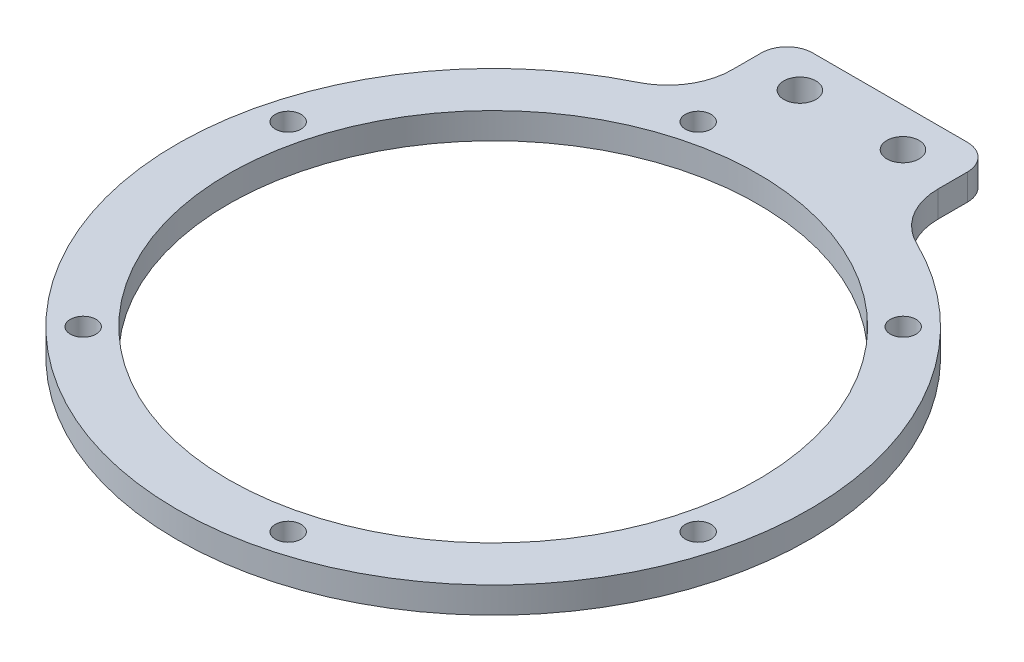
ISO-10303-21;
HEADER;
FILE_DESCRIPTION(('STEP AP214'),'2;1');
FILE_NAME('part.step','',(''),(''),'','','');
FILE_SCHEMA(('AUTOMOTIVE_DESIGN { 1 0 10303 214 1 1 1 1 }'));
ENDSEC;
DATA;
#1=APPLICATION_CONTEXT('core data for automotive mechanical design processes');
#2=APPLICATION_PROTOCOL_DEFINITION('international standard','automotive_design',2000,#1);
#3=PRODUCT_CONTEXT('',#1,'mechanical');
#4=PRODUCT('Part','Part','',(#3));
#5=PRODUCT_RELATED_PRODUCT_CATEGORY('part','',(#4));
#6=PRODUCT_DEFINITION_FORMATION('','',#4);
#7=PRODUCT_DEFINITION_CONTEXT('part definition',#1,'design');
#8=PRODUCT_DEFINITION('design','',#6,#7);
#9=PRODUCT_DEFINITION_SHAPE('','',#8);
#10=(LENGTH_UNIT() NAMED_UNIT(*) SI_UNIT(.MILLI.,.METRE.));
#11=(NAMED_UNIT(*) PLANE_ANGLE_UNIT() SI_UNIT($,.RADIAN.));
#12=(NAMED_UNIT(*) SI_UNIT($,.STERADIAN.) SOLID_ANGLE_UNIT());
#13=UNCERTAINTY_MEASURE_WITH_UNIT(LENGTH_MEASURE(1.E-05),#10,'distance_accuracy_value','');
#14=(GEOMETRIC_REPRESENTATION_CONTEXT(3) GLOBAL_UNCERTAINTY_ASSIGNED_CONTEXT((#13)) GLOBAL_UNIT_ASSIGNED_CONTEXT((#10,
#11,#12)) REPRESENTATION_CONTEXT('',''));
#15=CARTESIAN_POINT('',(0.,0.,0.));
#16=DIRECTION('',(0.,0.,1.));
#17=DIRECTION('',(1.,0.,0.));
#18=AXIS2_PLACEMENT_3D('',#15,#16,#17);
#19=CARTESIAN_POINT('',(0.,4.064,0.));
#20=DIRECTION('',(0.,1.,0.));
#21=DIRECTION('',(0.,0.,1.));
#22=AXIS2_PLACEMENT_3D('',#19,#20,#21);
#23=PLANE('',#22);
#24=CARTESIAN_POINT('',(-8.,4.064,-55.6));
#25=DIRECTION('',(0.,1.,0.));
#26=DIRECTION('',(0.,0.,1.));
#27=AXIS2_PLACEMENT_3D('',#24,#25,#26);
#28=CIRCLE('',#27,2.5);
#29=CARTESIAN_POINT('',(-8.,4.064,-53.1));
#30=VERTEX_POINT('',#29);
#31=EDGE_CURVE('E221',#30,#30,#28,.T.);
#32=ORIENTED_EDGE('',*,*,#31,.F.);
#33=EDGE_LOOP('',(#32));
#34=FACE_BOUND('',#33,.T.);
#35=CARTESIAN_POINT('',(-31.8198051533944,4.064,31.8198051533949));
#36=DIRECTION('',(0.,1.,0.));
#37=DIRECTION('',(0.,0.,1.));
#38=AXIS2_PLACEMENT_3D('',#35,#36,#37);
#39=CIRCLE('',#38,2.);
#40=CARTESIAN_POINT('',(-31.8198051533944,4.064,33.8198051533949));
#41=VERTEX_POINT('',#40);
#42=EDGE_CURVE('E209',#41,#41,#39,.T.);
#43=ORIENTED_EDGE('',*,*,#42,.F.);
#44=EDGE_LOOP('',(#43));
#45=FACE_BOUND('',#44,.T.);
#46=CARTESIAN_POINT('',(0.,4.064,0.));
#47=DIRECTION('',(0.,1.,0.));
#48=DIRECTION('',(0.,0.,1.));
#49=AXIS2_PLACEMENT_3D('',#46,#47,#48);
#50=CIRCLE('',#49,41.1);
#51=CARTESIAN_POINT('',(0.,4.064,41.1));
#52=VERTEX_POINT('',#51);
#53=EDGE_CURVE('E197',#52,#52,#50,.T.);
#54=ORIENTED_EDGE('',*,*,#53,.F.);
#55=EDGE_LOOP('',(#54));
#56=FACE_BOUND('',#55,.T.);
#57=CARTESIAN_POINT('',(31.8198051533944,4.064,-31.8198051533949));
#58=DIRECTION('',(0.,1.,0.));
#59=DIRECTION('',(0.,0.,1.));
#60=AXIS2_PLACEMENT_3D('',#57,#58,#59);
#61=CIRCLE('',#60,2.);
#62=CARTESIAN_POINT('',(31.8198051533944,4.064,-29.8198051533949));
#63=VERTEX_POINT('',#62);
#64=EDGE_CURVE('E185',#63,#63,#61,.T.);
#65=ORIENTED_EDGE('',*,*,#64,.F.);
#66=EDGE_LOOP('',(#65));
#67=FACE_BOUND('',#66,.T.);
#68=CARTESIAN_POINT('',(0.,4.064,0.));
#69=DIRECTION('',(0.,1.,0.));
#70=DIRECTION('',(0.,0.,1.));
#71=AXIS2_PLACEMENT_3D('',#68,#69,#70);
#72=CIRCLE('',#71,49.1);
#73=CARTESIAN_POINT('',(-21.6006768189509,4.064,-44.0933187791896));
#74=VERTEX_POINT('',#73);
#75=CARTESIAN_POINT('',(21.6006768189509,4.064,-44.0933187791896));
#76=VERTEX_POINT('',#75);
#77=EDGE_CURVE('E135',#74,#76,#72,.T.);
#78=ORIENTED_EDGE('',*,*,#77,.T.);
#79=CARTESIAN_POINT('',(26.,4.064,-53.0736281028535));
#80=DIRECTION('',(0.,1.,0.));
#81=DIRECTION('',(0.,0.,1.));
#82=AXIS2_PLACEMENT_3D('',#79,#80,#81);
#83=CIRCLE('',#82,10.);
#84=CARTESIAN_POINT('',(16.,4.064,-53.0736281028535));
#85=VERTEX_POINT('',#84);
#86=EDGE_CURVE('E157',#76,#85,#83,.F.);
#87=ORIENTED_EDGE('',*,*,#86,.T.);
#88=DIRECTION('',(0.,0.,-1.));
#89=VECTOR('',#88,1.);
#90=CARTESIAN_POINT('',(16.,4.064,-61.6));
#91=LINE('',#90,#89);
#92=CARTESIAN_POINT('',(16.,4.064,-57.6));
#93=VERTEX_POINT('',#92);
#94=EDGE_CURVE('E134',#85,#93,#91,.T.);
#95=ORIENTED_EDGE('',*,*,#94,.T.);
#96=CARTESIAN_POINT('',(12.,4.064,-57.6));
#97=DIRECTION('',(0.,1.,0.));
#98=DIRECTION('',(0.,0.,1.));
#99=AXIS2_PLACEMENT_3D('',#96,#97,#98);
#100=CIRCLE('',#99,4.);
#101=CARTESIAN_POINT('',(12.,4.064,-61.6));
#102=VERTEX_POINT('',#101);
#103=EDGE_CURVE('E141',#93,#102,#100,.T.);
#104=ORIENTED_EDGE('',*,*,#103,.T.);
#105=DIRECTION('',(-1.,0.,0.));
#106=VECTOR('',#105,1.);
#107=CARTESIAN_POINT('',(-16.,4.064,-61.6));
#108=LINE('',#107,#106);
#109=CARTESIAN_POINT('',(-12.,4.064,-61.6));
#110=VERTEX_POINT('',#109);
#111=EDGE_CURVE('E118',#102,#110,#108,.T.);
#112=ORIENTED_EDGE('',*,*,#111,.T.);
#113=CARTESIAN_POINT('',(-12.,4.064,-57.6));
#114=DIRECTION('',(0.,1.,0.));
#115=DIRECTION('',(0.,0.,1.));
#116=AXIS2_PLACEMENT_3D('',#113,#114,#115);
#117=CIRCLE('',#116,4.);
#118=CARTESIAN_POINT('',(-16.,4.064,-57.6));
#119=VERTEX_POINT('',#118);
#120=EDGE_CURVE('E139',#110,#119,#117,.T.);
#121=ORIENTED_EDGE('',*,*,#120,.T.);
#122=DIRECTION('',(0.,0.,1.));
#123=VECTOR('',#122,1.);
#124=CARTESIAN_POINT('',(-16.,4.064,-46.4199310641453));
#125=LINE('',#124,#123);
#126=CARTESIAN_POINT('',(-16.,4.064,-53.0736281028535));
#127=VERTEX_POINT('',#126);
#128=EDGE_CURVE('E176',#119,#127,#125,.T.);
#129=ORIENTED_EDGE('',*,*,#128,.T.);
#130=CARTESIAN_POINT('',(-26.,4.064,-53.0736281028535));
#131=DIRECTION('',(0.,1.,0.));
#132=DIRECTION('',(0.,0.,1.));
#133=AXIS2_PLACEMENT_3D('',#130,#131,#132);
#134=CIRCLE('',#133,10.);
#135=EDGE_CURVE('E11',#127,#74,#134,.F.);
#136=ORIENTED_EDGE('',*,*,#135,.T.);
#137=EDGE_LOOP('',(#78,#87,#95,#104,#112,#121,#129,#136));
#138=FACE_BOUND('',#137,.T.);
#139=CARTESIAN_POINT('',(-11.6468570296132,4.064,-43.4666621830081));
#140=DIRECTION('',(0.,1.,0.));
#141=DIRECTION('',(0.,0.,1.));
#142=AXIS2_PLACEMENT_3D('',#139,#140,#141);
#143=CIRCLE('',#142,1.99999999999936);
#144=CARTESIAN_POINT('',(-11.6468570296132,4.064,-41.4666621830088));
#145=VERTEX_POINT('',#144);
#146=EDGE_CURVE('E128',#145,#145,#143,.T.);
#147=ORIENTED_EDGE('',*,*,#146,.F.);
#148=EDGE_LOOP('',(#147));
#149=FACE_BOUND('',#148,.T.);
#150=CARTESIAN_POINT('',(43.4666621830082,4.064,11.6468570296131));
#151=DIRECTION('',(0.,1.,0.));
#152=DIRECTION('',(0.,0.,1.));
#153=AXIS2_PLACEMENT_3D('',#150,#151,#152);
#154=CIRCLE('',#153,2.00000000000001);
#155=CARTESIAN_POINT('',(43.4666621830082,4.064,13.6468570296131));
#156=VERTEX_POINT('',#155);
#157=EDGE_CURVE('E191',#156,#156,#154,.T.);
#158=ORIENTED_EDGE('',*,*,#157,.F.);
#159=EDGE_LOOP('',(#158));
#160=FACE_BOUND('',#159,.T.);
#161=CARTESIAN_POINT('',(11.6468570296138,4.064,43.466662183008));
#162=DIRECTION('',(0.,1.,0.));
#163=DIRECTION('',(0.,0.,1.));
#164=AXIS2_PLACEMENT_3D('',#161,#162,#163);
#165=CIRCLE('',#164,2.);
#166=CARTESIAN_POINT('',(11.6468570296138,4.064,45.466662183008));
#167=VERTEX_POINT('',#166);
#168=EDGE_CURVE('E203',#167,#167,#165,.T.);
#169=ORIENTED_EDGE('',*,*,#168,.F.);
#170=EDGE_LOOP('',(#169));
#171=FACE_BOUND('',#170,.T.);
#172=CARTESIAN_POINT('',(-43.4666621830082,4.064,-11.6468570296131));
#173=DIRECTION('',(0.,1.,0.));
#174=DIRECTION('',(0.,0.,1.));
#175=AXIS2_PLACEMENT_3D('',#172,#173,#174);
#176=CIRCLE('',#175,2.);
#177=CARTESIAN_POINT('',(-43.4666621830082,4.064,-9.64685702961307));
#178=VERTEX_POINT('',#177);
#179=EDGE_CURVE('E215',#178,#178,#176,.T.);
#180=ORIENTED_EDGE('',*,*,#179,.F.);
#181=EDGE_LOOP('',(#180));
#182=FACE_BOUND('',#181,.T.);
#183=CARTESIAN_POINT('',(8.,4.064,-55.6));
#184=DIRECTION('',(0.,1.,0.));
#185=DIRECTION('',(0.,0.,1.));
#186=AXIS2_PLACEMENT_3D('',#183,#184,#185);
#187=CIRCLE('',#186,2.5);
#188=CARTESIAN_POINT('',(8.,4.064,-53.1));
#189=VERTEX_POINT('',#188);
#190=EDGE_CURVE('E227',#189,#189,#187,.T.);
#191=ORIENTED_EDGE('',*,*,#190,.F.);
#192=EDGE_LOOP('',(#191));
#193=FACE_BOUND('',#192,.T.);
#194=ADVANCED_FACE('F34',(#34,#45,#56,#67,#138,#149,#160,#171,#182,#193),#23,.T.);
#195=CARTESIAN_POINT('',(0.,0.,0.));
#196=DIRECTION('',(0.,1.,0.));
#197=DIRECTION('',(0.,0.,1.));
#198=AXIS2_PLACEMENT_3D('',#195,#196,#197);
#199=PLANE('',#198);
#200=DIRECTION('',(-1.,0.,0.));
#201=VECTOR('',#200,1.);
#202=CARTESIAN_POINT('',(-16.,0.,-61.6));
#203=LINE('',#202,#201);
#204=CARTESIAN_POINT('',(12.,0.,-61.6));
#205=VERTEX_POINT('',#204);
#206=CARTESIAN_POINT('',(-12.,0.,-61.6));
#207=VERTEX_POINT('',#206);
#208=EDGE_CURVE('E115',#205,#207,#203,.T.);
#209=ORIENTED_EDGE('',*,*,#208,.F.);
#210=CARTESIAN_POINT('',(12.,0.,-57.6));
#211=DIRECTION('',(0.,1.,0.));
#212=DIRECTION('',(0.,0.,1.));
#213=AXIS2_PLACEMENT_3D('',#210,#211,#212);
#214=CIRCLE('',#213,4.);
#215=CARTESIAN_POINT('',(16.,0.,-57.6));
#216=VERTEX_POINT('',#215);
#217=EDGE_CURVE('E100',#205,#216,#214,.F.);
#218=ORIENTED_EDGE('',*,*,#217,.T.);
#219=DIRECTION('',(0.,0.,-1.));
#220=VECTOR('',#219,1.);
#221=CARTESIAN_POINT('',(16.,0.,-61.6));
#222=LINE('',#221,#220);
#223=CARTESIAN_POINT('',(16.,0.,-53.0736281028535));
#224=VERTEX_POINT('',#223);
#225=EDGE_CURVE('E124',#224,#216,#222,.T.);
#226=ORIENTED_EDGE('',*,*,#225,.F.);
#227=CARTESIAN_POINT('',(26.,0.,-53.0736281028535));
#228=DIRECTION('',(0.,1.,0.));
#229=DIRECTION('',(0.,0.,1.));
#230=AXIS2_PLACEMENT_3D('',#227,#228,#229);
#231=CIRCLE('',#230,10.);
#232=CARTESIAN_POINT('',(21.6006768189509,0.,-44.0933187791896));
#233=VERTEX_POINT('',#232);
#234=EDGE_CURVE('E155',#224,#233,#231,.T.);
#235=ORIENTED_EDGE('',*,*,#234,.T.);
#236=CARTESIAN_POINT('',(0.,0.,0.));
#237=DIRECTION('',(0.,1.,0.));
#238=DIRECTION('',(0.,0.,1.));
#239=AXIS2_PLACEMENT_3D('',#236,#237,#238);
#240=CIRCLE('',#239,49.1);
#241=CARTESIAN_POINT('',(-21.6006768189509,0.,-44.0933187791896));
#242=VERTEX_POINT('',#241);
#243=EDGE_CURVE('E126',#242,#233,#240,.T.);
#244=ORIENTED_EDGE('',*,*,#243,.F.);
#245=CARTESIAN_POINT('',(-26.,0.,-53.0736281028535));
#246=DIRECTION('',(0.,1.,0.));
#247=DIRECTION('',(0.,0.,1.));
#248=AXIS2_PLACEMENT_3D('',#245,#246,#247);
#249=CIRCLE('',#248,10.);
#250=CARTESIAN_POINT('',(-16.,0.,-53.0736281028535));
#251=VERTEX_POINT('',#250);
#252=EDGE_CURVE('E42',#242,#251,#249,.T.);
#253=ORIENTED_EDGE('',*,*,#252,.T.);
#254=DIRECTION('',(0.,0.,1.));
#255=VECTOR('',#254,1.);
#256=CARTESIAN_POINT('',(-16.,0.,-46.4199310641453));
#257=LINE('',#256,#255);
#258=CARTESIAN_POINT('',(-16.,0.,-57.6));
#259=VERTEX_POINT('',#258);
#260=EDGE_CURVE('E123',#259,#251,#257,.T.);
#261=ORIENTED_EDGE('',*,*,#260,.F.);
#262=CARTESIAN_POINT('',(-12.,0.,-57.6));
#263=DIRECTION('',(0.,1.,0.));
#264=DIRECTION('',(0.,0.,1.));
#265=AXIS2_PLACEMENT_3D('',#262,#263,#264);
#266=CIRCLE('',#265,4.);
#267=EDGE_CURVE('E109',#259,#207,#266,.F.);
#268=ORIENTED_EDGE('',*,*,#267,.T.);
#269=EDGE_LOOP('',(#209,#218,#226,#235,#244,#253,#261,#268));
#270=FACE_BOUND('',#269,.T.);
#271=CARTESIAN_POINT('',(-11.6468570296132,0.,-43.4666621830081));
#272=DIRECTION('',(0.,1.,0.));
#273=DIRECTION('',(0.,0.,1.));
#274=AXIS2_PLACEMENT_3D('',#271,#272,#273);
#275=CIRCLE('',#274,1.99999999999936);
#276=CARTESIAN_POINT('',(-11.6468570296132,0.,-41.4666621830088));
#277=VERTEX_POINT('',#276);
#278=EDGE_CURVE('E182',#277,#277,#275,.T.);
#279=ORIENTED_EDGE('',*,*,#278,.T.);
#280=EDGE_LOOP('',(#279));
#281=FACE_BOUND('',#280,.T.);
#282=CARTESIAN_POINT('',(31.8198051533944,0.,-31.8198051533949));
#283=DIRECTION('',(0.,1.,0.));
#284=DIRECTION('',(0.,0.,1.));
#285=AXIS2_PLACEMENT_3D('',#282,#283,#284);
#286=CIRCLE('',#285,2.);
#287=CARTESIAN_POINT('',(31.8198051533944,0.,-29.8198051533949));
#288=VERTEX_POINT('',#287);
#289=EDGE_CURVE('E188',#288,#288,#286,.T.);
#290=ORIENTED_EDGE('',*,*,#289,.T.);
#291=EDGE_LOOP('',(#290));
#292=FACE_BOUND('',#291,.T.);
#293=CARTESIAN_POINT('',(43.4666621830082,0.,11.6468570296131));
#294=DIRECTION('',(0.,1.,0.));
#295=DIRECTION('',(0.,0.,1.));
#296=AXIS2_PLACEMENT_3D('',#293,#294,#295);
#297=CIRCLE('',#296,2.00000000000001);
#298=CARTESIAN_POINT('',(43.4666621830082,0.,13.6468570296131));
#299=VERTEX_POINT('',#298);
#300=EDGE_CURVE('E194',#299,#299,#297,.T.);
#301=ORIENTED_EDGE('',*,*,#300,.T.);
#302=EDGE_LOOP('',(#301));
#303=FACE_BOUND('',#302,.T.);
#304=CARTESIAN_POINT('',(0.,0.,0.));
#305=DIRECTION('',(0.,1.,0.));
#306=DIRECTION('',(0.,0.,1.));
#307=AXIS2_PLACEMENT_3D('',#304,#305,#306);
#308=CIRCLE('',#307,41.1);
#309=CARTESIAN_POINT('',(0.,0.,41.1));
#310=VERTEX_POINT('',#309);
#311=EDGE_CURVE('E200',#310,#310,#308,.T.);
#312=ORIENTED_EDGE('',*,*,#311,.T.);
#313=EDGE_LOOP('',(#312));
#314=FACE_BOUND('',#313,.T.);
#315=CARTESIAN_POINT('',(11.6468570296138,0.,43.466662183008));
#316=DIRECTION('',(0.,1.,0.));
#317=DIRECTION('',(0.,0.,1.));
#318=AXIS2_PLACEMENT_3D('',#315,#316,#317);
#319=CIRCLE('',#318,2.);
#320=CARTESIAN_POINT('',(11.6468570296138,0.,45.466662183008));
#321=VERTEX_POINT('',#320);
#322=EDGE_CURVE('E206',#321,#321,#319,.T.);
#323=ORIENTED_EDGE('',*,*,#322,.T.);
#324=EDGE_LOOP('',(#323));
#325=FACE_BOUND('',#324,.T.);
#326=CARTESIAN_POINT('',(-31.8198051533944,0.,31.8198051533949));
#327=DIRECTION('',(0.,1.,0.));
#328=DIRECTION('',(0.,0.,1.));
#329=AXIS2_PLACEMENT_3D('',#326,#327,#328);
#330=CIRCLE('',#329,2.);
#331=CARTESIAN_POINT('',(-31.8198051533944,0.,33.8198051533949));
#332=VERTEX_POINT('',#331);
#333=EDGE_CURVE('E212',#332,#332,#330,.T.);
#334=ORIENTED_EDGE('',*,*,#333,.T.);
#335=EDGE_LOOP('',(#334));
#336=FACE_BOUND('',#335,.T.);
#337=CARTESIAN_POINT('',(-43.4666621830082,0.,-11.6468570296131));
#338=DIRECTION('',(0.,1.,0.));
#339=DIRECTION('',(0.,0.,1.));
#340=AXIS2_PLACEMENT_3D('',#337,#338,#339);
#341=CIRCLE('',#340,2.);
#342=CARTESIAN_POINT('',(-43.4666621830082,0.,-9.64685702961307));
#343=VERTEX_POINT('',#342);
#344=EDGE_CURVE('E218',#343,#343,#341,.T.);
#345=ORIENTED_EDGE('',*,*,#344,.T.);
#346=EDGE_LOOP('',(#345));
#347=FACE_BOUND('',#346,.T.);
#348=CARTESIAN_POINT('',(-8.,0.,-55.6));
#349=DIRECTION('',(0.,1.,0.));
#350=DIRECTION('',(0.,0.,1.));
#351=AXIS2_PLACEMENT_3D('',#348,#349,#350);
#352=CIRCLE('',#351,2.5);
#353=CARTESIAN_POINT('',(-8.,0.,-53.1));
#354=VERTEX_POINT('',#353);
#355=EDGE_CURVE('E224',#354,#354,#352,.T.);
#356=ORIENTED_EDGE('',*,*,#355,.T.);
#357=EDGE_LOOP('',(#356));
#358=FACE_BOUND('',#357,.T.);
#359=CARTESIAN_POINT('',(8.,0.,-55.6));
#360=DIRECTION('',(0.,1.,0.));
#361=DIRECTION('',(0.,0.,1.));
#362=AXIS2_PLACEMENT_3D('',#359,#360,#361);
#363=CIRCLE('',#362,2.5);
#364=CARTESIAN_POINT('',(8.,0.,-53.1));
#365=VERTEX_POINT('',#364);
#366=EDGE_CURVE('E230',#365,#365,#363,.T.);
#367=ORIENTED_EDGE('',*,*,#366,.T.);
#368=EDGE_LOOP('',(#367));
#369=FACE_BOUND('',#368,.T.);
#370=ADVANCED_FACE('F121',(#270,#281,#292,#303,#314,#325,#336,#347,#358,#369),#199,.F.);
#371=CARTESIAN_POINT('',(16.,4.064,-61.6));
#372=DIRECTION('',(-1.,0.,0.));
#373=DIRECTION('',(0.,0.,1.));
#374=AXIS2_PLACEMENT_3D('',#371,#372,#373);
#375=PLANE('',#374);
#376=ORIENTED_EDGE('',*,*,#94,.F.);
#377=DIRECTION('',(0.,1.,0.));
#378=VECTOR('',#377,1.);
#379=CARTESIAN_POINT('',(16.,0.,-53.0736281028535));
#380=LINE('',#379,#378);
#381=EDGE_CURVE('E146',#85,#224,#380,.F.);
#382=ORIENTED_EDGE('',*,*,#381,.T.);
#383=ORIENTED_EDGE('',*,*,#225,.T.);
#384=DIRECTION('',(0.,-1.,0.));
#385=VECTOR('',#384,1.);
#386=CARTESIAN_POINT('',(16.,4.064,-57.6));
#387=LINE('',#386,#385);
#388=EDGE_CURVE('E106',#216,#93,#387,.F.);
#389=ORIENTED_EDGE('',*,*,#388,.T.);
#390=EDGE_LOOP('',(#376,#382,#383,#389));
#391=FACE_BOUND('',#390,.T.);
#392=ADVANCED_FACE('F168',(#391),#375,.F.);
#393=CARTESIAN_POINT('',(-16.,4.064,-61.6));
#394=DIRECTION('',(0.,0.,1.));
#395=DIRECTION('',(1.,0.,0.));
#396=AXIS2_PLACEMENT_3D('',#393,#394,#395);
#397=PLANE('',#396);
#398=ORIENTED_EDGE('',*,*,#111,.F.);
#399=DIRECTION('',(0.,-1.,0.));
#400=VECTOR('',#399,1.);
#401=CARTESIAN_POINT('',(12.,4.064,-61.6));
#402=LINE('',#401,#400);
#403=EDGE_CURVE('E104',#102,#205,#402,.T.);
#404=ORIENTED_EDGE('',*,*,#403,.T.);
#405=ORIENTED_EDGE('',*,*,#208,.T.);
#406=DIRECTION('',(0.,-1.,0.));
#407=VECTOR('',#406,1.);
#408=CARTESIAN_POINT('',(-12.,4.064,-61.6));
#409=LINE('',#408,#407);
#410=EDGE_CURVE('E119',#207,#110,#409,.F.);
#411=ORIENTED_EDGE('',*,*,#410,.T.);
#412=EDGE_LOOP('',(#398,#404,#405,#411));
#413=FACE_BOUND('',#412,.T.);
#414=ADVANCED_FACE('F114',(#413),#397,.F.);
#415=CARTESIAN_POINT('',(-16.,4.064,-46.4199310641453));
#416=DIRECTION('',(1.,0.,0.));
#417=DIRECTION('',(0.,0.,-1.));
#418=AXIS2_PLACEMENT_3D('',#415,#416,#417);
#419=PLANE('',#418);
#420=ORIENTED_EDGE('',*,*,#260,.T.);
#421=DIRECTION('',(0.,1.,0.));
#422=VECTOR('',#421,1.);
#423=CARTESIAN_POINT('',(-16.,4.064,-53.0736281028535));
#424=LINE('',#423,#422);
#425=EDGE_CURVE('E55',#251,#127,#424,.T.);
#426=ORIENTED_EDGE('',*,*,#425,.T.);
#427=ORIENTED_EDGE('',*,*,#128,.F.);
#428=DIRECTION('',(0.,-1.,0.));
#429=VECTOR('',#428,1.);
#430=CARTESIAN_POINT('',(-16.,4.064,-57.6));
#431=LINE('',#430,#429);
#432=EDGE_CURVE('E143',#119,#259,#431,.T.);
#433=ORIENTED_EDGE('',*,*,#432,.T.);
#434=EDGE_LOOP('',(#420,#426,#427,#433));
#435=FACE_BOUND('',#434,.T.);
#436=ADVANCED_FACE('F254',(#435),#419,.F.);
#437=CARTESIAN_POINT('',(0.,4.064,0.));
#438=DIRECTION('',(0.,-1.,0.));
#439=DIRECTION('',(0.,0.,-1.));
#440=AXIS2_PLACEMENT_3D('',#437,#438,#439);
#441=CYLINDRICAL_SURFACE('',#440,49.1);
#442=ORIENTED_EDGE('',*,*,#243,.T.);
#443=DIRECTION('',(0.,-1.,0.));
#444=VECTOR('',#443,1.);
#445=CARTESIAN_POINT('',(21.6006768189509,4.064,-44.0933187791896));
#446=LINE('',#445,#444);
#447=EDGE_CURVE('E152',#233,#76,#446,.F.);
#448=ORIENTED_EDGE('',*,*,#447,.T.);
#449=ORIENTED_EDGE('',*,*,#77,.F.);
#450=DIRECTION('',(0.,-1.,0.));
#451=VECTOR('',#450,1.);
#452=CARTESIAN_POINT('',(-21.6006768189509,4.064,-44.0933187791896));
#453=LINE('',#452,#451);
#454=EDGE_CURVE('E149',#74,#242,#453,.T.);
#455=ORIENTED_EDGE('',*,*,#454,.T.);
#456=EDGE_LOOP('',(#442,#448,#449,#455));
#457=FACE_BOUND('',#456,.T.);
#458=ADVANCED_FACE('F172',(#457),#441,.T.);
#459=CARTESIAN_POINT('',(-11.6468570296132,4.064,-43.4666621830081));
#460=DIRECTION('',(0.,-1.,0.));
#461=DIRECTION('',(0.,0.,-1.));
#462=AXIS2_PLACEMENT_3D('',#459,#460,#461);
#463=CYLINDRICAL_SURFACE('',#462,1.99999999999936);
#464=ORIENTED_EDGE('',*,*,#146,.T.);
#465=EDGE_LOOP('',(#464));
#466=FACE_BOUND('',#465,.T.);
#467=ORIENTED_EDGE('',*,*,#278,.F.);
#468=EDGE_LOOP('',(#467));
#469=FACE_BOUND('',#468,.T.);
#470=ADVANCED_FACE('F249',(#466,#469),#463,.F.);
#471=CARTESIAN_POINT('',(31.8198051533944,4.064,-31.8198051533949));
#472=DIRECTION('',(0.,-1.,0.));
#473=DIRECTION('',(0.,0.,-1.));
#474=AXIS2_PLACEMENT_3D('',#471,#472,#473);
#475=CYLINDRICAL_SURFACE('',#474,2.);
#476=ORIENTED_EDGE('',*,*,#64,.T.);
#477=EDGE_LOOP('',(#476));
#478=FACE_BOUND('',#477,.T.);
#479=ORIENTED_EDGE('',*,*,#289,.F.);
#480=EDGE_LOOP('',(#479));
#481=FACE_BOUND('',#480,.T.);
#482=ADVANCED_FACE('F394',(#478,#481),#475,.F.);
#483=CARTESIAN_POINT('',(43.4666621830082,4.064,11.6468570296131));
#484=DIRECTION('',(0.,-1.,0.));
#485=DIRECTION('',(0.,0.,-1.));
#486=AXIS2_PLACEMENT_3D('',#483,#484,#485);
#487=CYLINDRICAL_SURFACE('',#486,2.00000000000001);
#488=ORIENTED_EDGE('',*,*,#157,.T.);
#489=EDGE_LOOP('',(#488));
#490=FACE_BOUND('',#489,.T.);
#491=ORIENTED_EDGE('',*,*,#300,.F.);
#492=EDGE_LOOP('',(#491));
#493=FACE_BOUND('',#492,.T.);
#494=ADVANCED_FACE('F384',(#490,#493),#487,.F.);
#495=CARTESIAN_POINT('',(0.,4.064,0.));
#496=DIRECTION('',(0.,-1.,0.));
#497=DIRECTION('',(0.,0.,-1.));
#498=AXIS2_PLACEMENT_3D('',#495,#496,#497);
#499=CYLINDRICAL_SURFACE('',#498,41.1);
#500=ORIENTED_EDGE('',*,*,#53,.T.);
#501=EDGE_LOOP('',(#500));
#502=FACE_BOUND('',#501,.T.);
#503=ORIENTED_EDGE('',*,*,#311,.F.);
#504=EDGE_LOOP('',(#503));
#505=FACE_BOUND('',#504,.T.);
#506=ADVANCED_FACE('F374',(#502,#505),#499,.F.);
#507=CARTESIAN_POINT('',(11.6468570296138,4.064,43.466662183008));
#508=DIRECTION('',(0.,-1.,0.));
#509=DIRECTION('',(0.,0.,-1.));
#510=AXIS2_PLACEMENT_3D('',#507,#508,#509);
#511=CYLINDRICAL_SURFACE('',#510,2.);
#512=ORIENTED_EDGE('',*,*,#168,.T.);
#513=EDGE_LOOP('',(#512));
#514=FACE_BOUND('',#513,.T.);
#515=ORIENTED_EDGE('',*,*,#322,.F.);
#516=EDGE_LOOP('',(#515));
#517=FACE_BOUND('',#516,.T.);
#518=ADVANCED_FACE('F364',(#514,#517),#511,.F.);
#519=CARTESIAN_POINT('',(-31.8198051533944,4.064,31.8198051533949));
#520=DIRECTION('',(0.,-1.,0.));
#521=DIRECTION('',(0.,0.,-1.));
#522=AXIS2_PLACEMENT_3D('',#519,#520,#521);
#523=CYLINDRICAL_SURFACE('',#522,2.);
#524=ORIENTED_EDGE('',*,*,#42,.T.);
#525=EDGE_LOOP('',(#524));
#526=FACE_BOUND('',#525,.T.);
#527=ORIENTED_EDGE('',*,*,#333,.F.);
#528=EDGE_LOOP('',(#527));
#529=FACE_BOUND('',#528,.T.);
#530=ADVANCED_FACE('F354',(#526,#529),#523,.F.);
#531=CARTESIAN_POINT('',(-43.4666621830082,4.064,-11.6468570296131));
#532=DIRECTION('',(0.,-1.,0.));
#533=DIRECTION('',(0.,0.,-1.));
#534=AXIS2_PLACEMENT_3D('',#531,#532,#533);
#535=CYLINDRICAL_SURFACE('',#534,2.);
#536=ORIENTED_EDGE('',*,*,#179,.T.);
#537=EDGE_LOOP('',(#536));
#538=FACE_BOUND('',#537,.T.);
#539=ORIENTED_EDGE('',*,*,#344,.F.);
#540=EDGE_LOOP('',(#539));
#541=FACE_BOUND('',#540,.T.);
#542=ADVANCED_FACE('F344',(#538,#541),#535,.F.);
#543=CARTESIAN_POINT('',(-8.,4.064,-55.6));
#544=DIRECTION('',(0.,-1.,0.));
#545=DIRECTION('',(0.,0.,-1.));
#546=AXIS2_PLACEMENT_3D('',#543,#544,#545);
#547=CYLINDRICAL_SURFACE('',#546,2.5);
#548=ORIENTED_EDGE('',*,*,#31,.T.);
#549=EDGE_LOOP('',(#548));
#550=FACE_BOUND('',#549,.T.);
#551=ORIENTED_EDGE('',*,*,#355,.F.);
#552=EDGE_LOOP('',(#551));
#553=FACE_BOUND('',#552,.T.);
#554=ADVANCED_FACE('F335',(#550,#553),#547,.F.);
#555=CARTESIAN_POINT('',(8.,4.064,-55.6));
#556=DIRECTION('',(0.,-1.,0.));
#557=DIRECTION('',(0.,0.,-1.));
#558=AXIS2_PLACEMENT_3D('',#555,#556,#557);
#559=CYLINDRICAL_SURFACE('',#558,2.5);
#560=ORIENTED_EDGE('',*,*,#190,.T.);
#561=EDGE_LOOP('',(#560));
#562=FACE_BOUND('',#561,.T.);
#563=ORIENTED_EDGE('',*,*,#366,.F.);
#564=EDGE_LOOP('',(#563));
#565=FACE_BOUND('',#564,.T.);
#566=ADVANCED_FACE('F236',(#562,#565),#559,.F.);
#567=CARTESIAN_POINT('',(12.,4.064,-57.6));
#568=DIRECTION('',(0.,-1.,0.));
#569=DIRECTION('',(0.,0.,-1.));
#570=AXIS2_PLACEMENT_3D('',#567,#568,#569);
#571=CYLINDRICAL_SURFACE('',#570,4.);
#572=ORIENTED_EDGE('',*,*,#103,.F.);
#573=ORIENTED_EDGE('',*,*,#388,.F.);
#574=ORIENTED_EDGE('',*,*,#217,.F.);
#575=ORIENTED_EDGE('',*,*,#403,.F.);
#576=EDGE_LOOP('',(#572,#573,#574,#575));
#577=FACE_BOUND('',#576,.T.);
#578=ADVANCED_FACE('F103',(#577),#571,.T.);
#579=CARTESIAN_POINT('',(-12.,4.064,-57.6));
#580=DIRECTION('',(0.,-1.,0.));
#581=DIRECTION('',(0.,0.,-1.));
#582=AXIS2_PLACEMENT_3D('',#579,#580,#581);
#583=CYLINDRICAL_SURFACE('',#582,4.);
#584=ORIENTED_EDGE('',*,*,#120,.F.);
#585=ORIENTED_EDGE('',*,*,#410,.F.);
#586=ORIENTED_EDGE('',*,*,#267,.F.);
#587=ORIENTED_EDGE('',*,*,#432,.F.);
#588=EDGE_LOOP('',(#584,#585,#586,#587));
#589=FACE_BOUND('',#588,.T.);
#590=ADVANCED_FACE('F263',(#589),#583,.T.);
#591=CARTESIAN_POINT('',(26.,4.064,-53.0736281028535));
#592=DIRECTION('',(0.,-1.,0.));
#593=DIRECTION('',(0.,0.,-1.));
#594=AXIS2_PLACEMENT_3D('',#591,#592,#593);
#595=CYLINDRICAL_SURFACE('',#594,10.);
#596=ORIENTED_EDGE('',*,*,#86,.F.);
#597=ORIENTED_EDGE('',*,*,#447,.F.);
#598=ORIENTED_EDGE('',*,*,#234,.F.);
#599=ORIENTED_EDGE('',*,*,#381,.F.);
#600=EDGE_LOOP('',(#596,#597,#598,#599));
#601=FACE_BOUND('',#600,.T.);
#602=ADVANCED_FACE('F170',(#601),#595,.F.);
#603=CARTESIAN_POINT('',(-26.,4.064,-53.0736281028535));
#604=DIRECTION('',(0.,-1.,0.));
#605=DIRECTION('',(0.,0.,-1.));
#606=AXIS2_PLACEMENT_3D('',#603,#604,#605);
#607=CYLINDRICAL_SURFACE('',#606,10.);
#608=ORIENTED_EDGE('',*,*,#135,.F.);
#609=ORIENTED_EDGE('',*,*,#425,.F.);
#610=ORIENTED_EDGE('',*,*,#252,.F.);
#611=ORIENTED_EDGE('',*,*,#454,.F.);
#612=EDGE_LOOP('',(#608,#609,#610,#611));
#613=FACE_BOUND('',#612,.T.);
#614=ADVANCED_FACE('F36',(#613),#607,.F.);
#615=CLOSED_SHELL('',(#194,#370,#392,#414,#436,#458,#470,#482,#494,#506,#518,#530,#542,#554,
#566,#578,#590,#602,#614));
#616=MANIFOLD_SOLID_BREP('B2',#615);
#617=ADVANCED_BREP_SHAPE_REPRESENTATION('',(#18,#616),#14);
#618=SHAPE_DEFINITION_REPRESENTATION(#9,#617);
ENDSEC;
END-ISO-10303-21;
